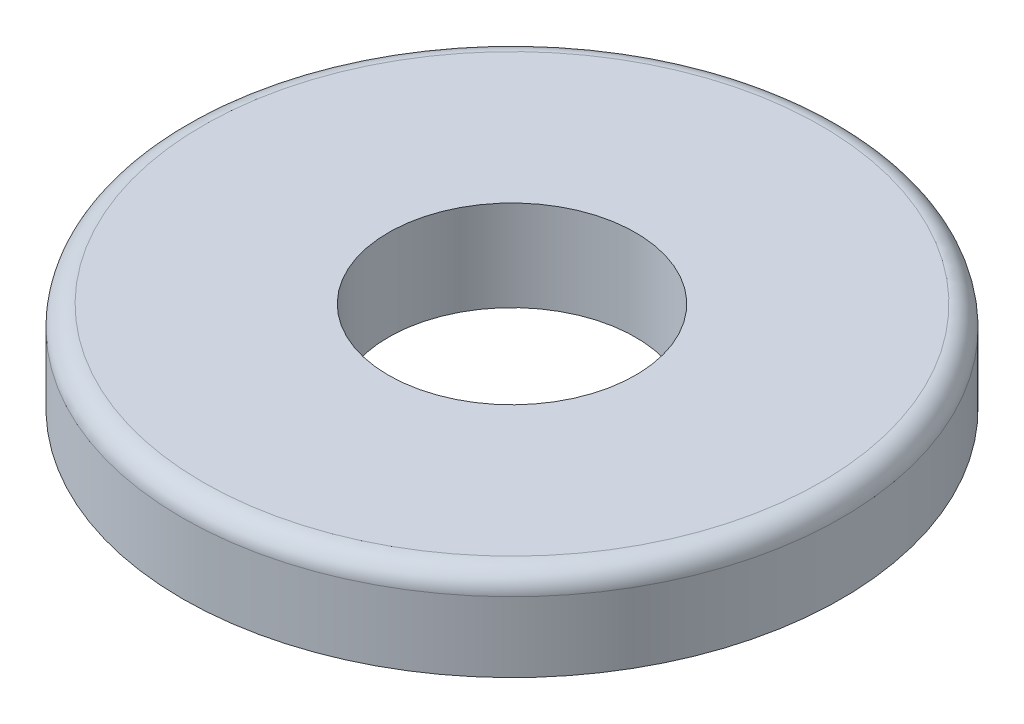
ISO-10303-21;
HEADER;
FILE_DESCRIPTION(('STEP AP214'),'2;1');
FILE_NAME('part.step','',(''),(''),'','','');
FILE_SCHEMA(('AUTOMOTIVE_DESIGN { 1 0 10303 214 1 1 1 1 }'));
ENDSEC;
DATA;
#1=APPLICATION_CONTEXT('core data for automotive mechanical design processes');
#2=APPLICATION_PROTOCOL_DEFINITION('international standard','automotive_design',2000,#1);
#3=PRODUCT_CONTEXT('',#1,'mechanical');
#4=PRODUCT('Part','Part','',(#3));
#5=PRODUCT_RELATED_PRODUCT_CATEGORY('part','',(#4));
#6=PRODUCT_DEFINITION_FORMATION('','',#4);
#7=PRODUCT_DEFINITION_CONTEXT('part definition',#1,'design');
#8=PRODUCT_DEFINITION('design','',#6,#7);
#9=PRODUCT_DEFINITION_SHAPE('','',#8);
#10=(LENGTH_UNIT() NAMED_UNIT(*) SI_UNIT(.MILLI.,.METRE.));
#11=(NAMED_UNIT(*) PLANE_ANGLE_UNIT() SI_UNIT($,.RADIAN.));
#12=(NAMED_UNIT(*) SI_UNIT($,.STERADIAN.) SOLID_ANGLE_UNIT());
#13=UNCERTAINTY_MEASURE_WITH_UNIT(LENGTH_MEASURE(1.E-05),#10,'distance_accuracy_value','');
#14=(GEOMETRIC_REPRESENTATION_CONTEXT(3) GLOBAL_UNCERTAINTY_ASSIGNED_CONTEXT((#13)) GLOBAL_UNIT_ASSIGNED_CONTEXT((#10,
#11,#12)) REPRESENTATION_CONTEXT('',''));
#15=CARTESIAN_POINT('',(0.,0.,0.));
#16=DIRECTION('',(0.,0.,1.));
#17=DIRECTION('',(1.,0.,0.));
#18=AXIS2_PLACEMENT_3D('',#15,#16,#17);
#19=CARTESIAN_POINT('',(0.,1.1,0.));
#20=DIRECTION('',(0.,-1.,0.));
#21=DIRECTION('',(0.,0.,-1.));
#22=AXIS2_PLACEMENT_3D('',#19,#20,#21);
#23=CYLINDRICAL_SURFACE('',#22,4.);
#24=CARTESIAN_POINT('',(0.,0.85,0.));
#25=DIRECTION('',(0.,1.,0.));
#26=DIRECTION('',(0.,0.,1.));
#27=AXIS2_PLACEMENT_3D('',#24,#25,#26);
#28=CIRCLE('',#27,4.);
#29=CARTESIAN_POINT('',(0.,0.85,4.));
#30=VERTEX_POINT('',#29);
#31=EDGE_CURVE('E10',#30,#30,#28,.F.);
#32=ORIENTED_EDGE('',*,*,#31,.T.);
#33=EDGE_LOOP('',(#32));
#34=FACE_BOUND('',#33,.T.);
#35=CARTESIAN_POINT('',(0.,0.,0.));
#36=DIRECTION('',(0.,1.,0.));
#37=DIRECTION('',(0.,0.,1.));
#38=AXIS2_PLACEMENT_3D('',#35,#36,#37);
#39=CIRCLE('',#38,4.);
#40=CARTESIAN_POINT('',(0.,0.,4.));
#41=VERTEX_POINT('',#40);
#42=EDGE_CURVE('E42',#41,#41,#39,.T.);
#43=ORIENTED_EDGE('',*,*,#42,.T.);
#44=EDGE_LOOP('',(#43));
#45=FACE_BOUND('',#44,.T.);
#46=ADVANCED_FACE('F31',(#34,#45),#23,.T.);
#47=CARTESIAN_POINT('',(0.,1.1,0.));
#48=DIRECTION('',(0.,1.,0.));
#49=DIRECTION('',(0.,0.,1.));
#50=AXIS2_PLACEMENT_3D('',#47,#48,#49);
#51=PLANE('',#50);
#52=CARTESIAN_POINT('',(0.,1.1,0.));
#53=DIRECTION('',(0.,1.,0.));
#54=DIRECTION('',(0.,0.,1.));
#55=AXIS2_PLACEMENT_3D('',#52,#53,#54);
#56=CIRCLE('',#55,3.75);
#57=CARTESIAN_POINT('',(0.,1.1,3.75));
#58=VERTEX_POINT('',#57);
#59=EDGE_CURVE('E38',#58,#58,#56,.T.);
#60=ORIENTED_EDGE('',*,*,#59,.T.);
#61=EDGE_LOOP('',(#60));
#62=FACE_BOUND('',#61,.T.);
#63=CARTESIAN_POINT('',(0.,1.1,0.));
#64=DIRECTION('',(0.,1.,0.));
#65=DIRECTION('',(0.,0.,1.));
#66=AXIS2_PLACEMENT_3D('',#63,#64,#65);
#67=CIRCLE('',#66,1.5);
#68=CARTESIAN_POINT('',(0.,1.1,1.5));
#69=VERTEX_POINT('',#68);
#70=EDGE_CURVE('E49',#69,#69,#67,.T.);
#71=ORIENTED_EDGE('',*,*,#70,.F.);
#72=EDGE_LOOP('',(#71));
#73=FACE_BOUND('',#72,.T.);
#74=ADVANCED_FACE('F64',(#62,#73),#51,.T.);
#75=CARTESIAN_POINT('',(0.,0.,0.));
#76=DIRECTION('',(0.,1.,0.));
#77=DIRECTION('',(0.,0.,1.));
#78=AXIS2_PLACEMENT_3D('',#75,#76,#77);
#79=PLANE('',#78);
#80=CARTESIAN_POINT('',(0.,0.,0.));
#81=DIRECTION('',(0.,1.,0.));
#82=DIRECTION('',(0.,0.,1.));
#83=AXIS2_PLACEMENT_3D('',#80,#81,#82);
#84=CIRCLE('',#83,1.5);
#85=CARTESIAN_POINT('',(0.,0.,1.5));
#86=VERTEX_POINT('',#85);
#87=EDGE_CURVE('E46',#86,#86,#84,.T.);
#88=ORIENTED_EDGE('',*,*,#87,.T.);
#89=EDGE_LOOP('',(#88));
#90=FACE_BOUND('',#89,.T.);
#91=ORIENTED_EDGE('',*,*,#42,.F.);
#92=EDGE_LOOP('',(#91));
#93=FACE_BOUND('',#92,.T.);
#94=ADVANCED_FACE('F55',(#90,#93),#79,.F.);
#95=CARTESIAN_POINT('',(0.,0.,0.));
#96=DIRECTION('',(0.,1.,0.));
#97=DIRECTION('',(0.,0.,1.));
#98=AXIS2_PLACEMENT_3D('',#95,#96,#97);
#99=CYLINDRICAL_SURFACE('',#98,1.5);
#100=ORIENTED_EDGE('',*,*,#87,.F.);
#101=EDGE_LOOP('',(#100));
#102=FACE_BOUND('',#101,.T.);
#103=ORIENTED_EDGE('',*,*,#70,.T.);
#104=EDGE_LOOP('',(#103));
#105=FACE_BOUND('',#104,.T.);
#106=ADVANCED_FACE('F58',(#102,#105),#99,.F.);
#107=CARTESIAN_POINT('',(0.,0.85,0.));
#108=DIRECTION('',(0.,1.,0.));
#109=DIRECTION('',(0.,0.,1.));
#110=AXIS2_PLACEMENT_3D('',#107,#108,#109);
#111=TOROIDAL_SURFACE('',#110,3.75,0.25);
#112=ORIENTED_EDGE('',*,*,#31,.F.);
#113=EDGE_LOOP('',(#112));
#114=FACE_BOUND('',#113,.T.);
#115=ORIENTED_EDGE('',*,*,#59,.F.);
#116=EDGE_LOOP('',(#115));
#117=FACE_BOUND('',#116,.T.);
#118=ADVANCED_FACE('F33',(#114,#117),#111,.T.);
#119=CLOSED_SHELL('',(#46,#74,#94,#106,#118));
#120=MANIFOLD_SOLID_BREP('B2',#119);
#121=ADVANCED_BREP_SHAPE_REPRESENTATION('',(#18,#120),#14);
#122=SHAPE_DEFINITION_REPRESENTATION(#9,#121);
ENDSEC;
END-ISO-10303-21;
